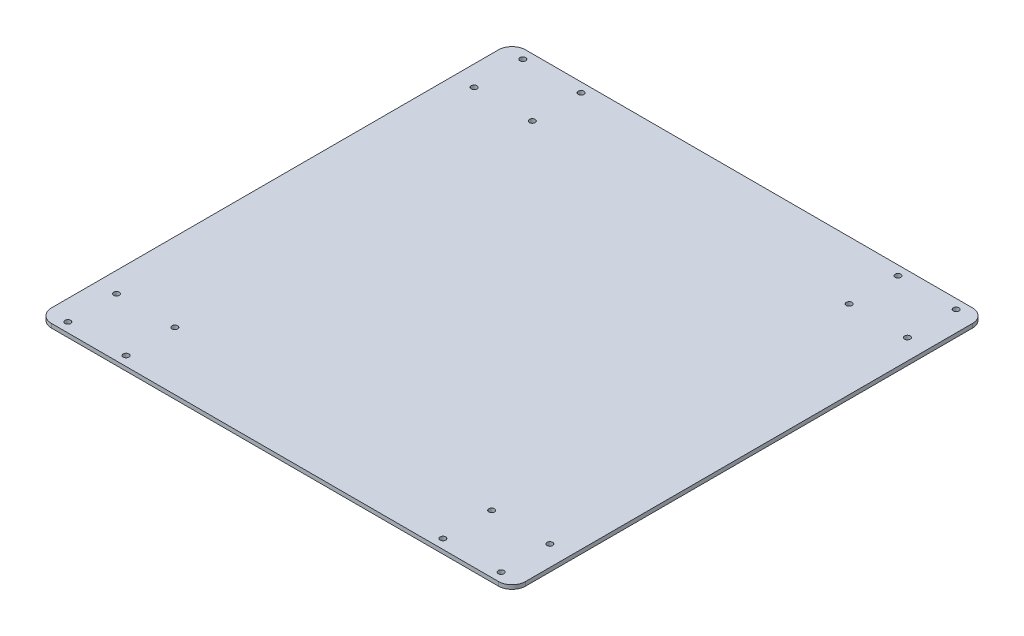
ISO-10303-21;
HEADER;
FILE_DESCRIPTION(('STEP AP214'),'2;1');
FILE_NAME('part.step','',(''),(''),'','','');
FILE_SCHEMA(('AUTOMOTIVE_DESIGN { 1 0 10303 214 1 1 1 1 }'));
ENDSEC;
DATA;
#1=APPLICATION_CONTEXT('core data for automotive mechanical design processes');
#2=APPLICATION_PROTOCOL_DEFINITION('international standard','automotive_design',2000,#1);
#3=PRODUCT_CONTEXT('',#1,'mechanical');
#4=PRODUCT('Part','Part','',(#3));
#5=PRODUCT_RELATED_PRODUCT_CATEGORY('part','',(#4));
#6=PRODUCT_DEFINITION_FORMATION('','',#4);
#7=PRODUCT_DEFINITION_CONTEXT('part definition',#1,'design');
#8=PRODUCT_DEFINITION('design','',#6,#7);
#9=PRODUCT_DEFINITION_SHAPE('','',#8);
#10=(LENGTH_UNIT() NAMED_UNIT(*) SI_UNIT(.MILLI.,.METRE.));
#11=(NAMED_UNIT(*) PLANE_ANGLE_UNIT() SI_UNIT($,.RADIAN.));
#12=(NAMED_UNIT(*) SI_UNIT($,.STERADIAN.) SOLID_ANGLE_UNIT());
#13=UNCERTAINTY_MEASURE_WITH_UNIT(LENGTH_MEASURE(1.E-05),#10,'distance_accuracy_value','');
#14=(GEOMETRIC_REPRESENTATION_CONTEXT(3) GLOBAL_UNCERTAINTY_ASSIGNED_CONTEXT((#13)) GLOBAL_UNIT_ASSIGNED_CONTEXT((#10,
#11,#12)) REPRESENTATION_CONTEXT('',''));
#15=CARTESIAN_POINT('',(0.,0.,0.));
#16=DIRECTION('',(0.,0.,1.));
#17=DIRECTION('',(1.,0.,0.));
#18=AXIS2_PLACEMENT_3D('',#15,#16,#17);
#19=CARTESIAN_POINT('',(0.,3.,0.));
#20=DIRECTION('',(1.,0.,0.));
#21=DIRECTION('',(0.,0.,-1.));
#22=AXIS2_PLACEMENT_3D('',#19,#20,#21);
#23=PLANE('',#22);
#24=DIRECTION('',(0.,0.,1.));
#25=VECTOR('',#24,1.);
#26=CARTESIAN_POINT('',(0.,3.,0.));
#27=LINE('',#26,#25);
#28=CARTESIAN_POINT('',(0.,3.,-340.));
#29=VERTEX_POINT('',#28);
#30=CARTESIAN_POINT('',(0.,3.,-10.));
#31=VERTEX_POINT('',#30);
#32=EDGE_CURVE('E127',#29,#31,#27,.T.);
#33=ORIENTED_EDGE('',*,*,#32,.F.);
#34=DIRECTION('',(0.,-1.,0.));
#35=VECTOR('',#34,1.);
#36=CARTESIAN_POINT('',(0.,3.,-340.));
#37=LINE('',#36,#35);
#38=CARTESIAN_POINT('',(0.,0.,-340.));
#39=VERTEX_POINT('',#38);
#40=EDGE_CURVE('E112',#29,#39,#37,.T.);
#41=ORIENTED_EDGE('',*,*,#40,.T.);
#42=DIRECTION('',(0.,0.,1.));
#43=VECTOR('',#42,1.);
#44=CARTESIAN_POINT('',(0.,0.,0.));
#45=LINE('',#44,#43);
#46=CARTESIAN_POINT('',(0.,0.,-10.));
#47=VERTEX_POINT('',#46);
#48=EDGE_CURVE('E124',#39,#47,#45,.T.);
#49=ORIENTED_EDGE('',*,*,#48,.T.);
#50=DIRECTION('',(0.,-1.,0.));
#51=VECTOR('',#50,1.);
#52=CARTESIAN_POINT('',(0.,3.,-10.));
#53=LINE('',#52,#51);
#54=EDGE_CURVE('E129',#47,#31,#53,.F.);
#55=ORIENTED_EDGE('',*,*,#54,.T.);
#56=EDGE_LOOP('',(#33,#41,#49,#55));
#57=FACE_BOUND('',#56,.T.);
#58=ADVANCED_FACE('F42',(#57),#23,.F.);
#59=CARTESIAN_POINT('',(0.,3.,0.));
#60=DIRECTION('',(0.,0.,-1.));
#61=DIRECTION('',(-1.,0.,0.));
#62=AXIS2_PLACEMENT_3D('',#59,#60,#61);
#63=PLANE('',#62);
#64=DIRECTION('',(1.,0.,0.));
#65=VECTOR('',#64,1.);
#66=CARTESIAN_POINT('',(0.,0.,0.));
#67=LINE('',#66,#65);
#68=CARTESIAN_POINT('',(10.,0.,0.));
#69=VERTEX_POINT('',#68);
#70=CARTESIAN_POINT('',(340.,0.,0.));
#71=VERTEX_POINT('',#70);
#72=EDGE_CURVE('E133',#69,#71,#67,.T.);
#73=ORIENTED_EDGE('',*,*,#72,.T.);
#74=DIRECTION('',(0.,-1.,0.));
#75=VECTOR('',#74,1.);
#76=CARTESIAN_POINT('',(340.,3.,0.));
#77=LINE('',#76,#75);
#78=CARTESIAN_POINT('',(340.,3.,0.));
#79=VERTEX_POINT('',#78);
#80=EDGE_CURVE('E11',#71,#79,#77,.F.);
#81=ORIENTED_EDGE('',*,*,#80,.T.);
#82=DIRECTION('',(1.,0.,0.));
#83=VECTOR('',#82,1.);
#84=CARTESIAN_POINT('',(0.,3.,0.));
#85=LINE('',#84,#83);
#86=CARTESIAN_POINT('',(10.,3.,0.));
#87=VERTEX_POINT('',#86);
#88=EDGE_CURVE('E173',#87,#79,#85,.T.);
#89=ORIENTED_EDGE('',*,*,#88,.F.);
#90=DIRECTION('',(0.,-1.,0.));
#91=VECTOR('',#90,1.);
#92=CARTESIAN_POINT('',(10.,3.,0.));
#93=LINE('',#92,#91);
#94=EDGE_CURVE('E50',#87,#69,#93,.T.);
#95=ORIENTED_EDGE('',*,*,#94,.T.);
#96=EDGE_LOOP('',(#73,#81,#89,#95));
#97=FACE_BOUND('',#96,.T.);
#98=ADVANCED_FACE('F171',(#97),#63,.F.);
#99=CARTESIAN_POINT('',(350.,3.,0.));
#100=DIRECTION('',(-1.,0.,0.));
#101=DIRECTION('',(0.,0.,1.));
#102=AXIS2_PLACEMENT_3D('',#99,#100,#101);
#103=PLANE('',#102);
#104=DIRECTION('',(0.,0.,-1.));
#105=VECTOR('',#104,1.);
#106=CARTESIAN_POINT('',(350.,0.,0.));
#107=LINE('',#106,#105);
#108=CARTESIAN_POINT('',(350.,0.,-10.));
#109=VERTEX_POINT('',#108);
#110=CARTESIAN_POINT('',(350.,0.,-340.));
#111=VERTEX_POINT('',#110);
#112=EDGE_CURVE('E137',#109,#111,#107,.T.);
#113=ORIENTED_EDGE('',*,*,#112,.T.);
#114=DIRECTION('',(0.,-1.,0.));
#115=VECTOR('',#114,1.);
#116=CARTESIAN_POINT('',(350.,3.,-340.));
#117=LINE('',#116,#115);
#118=CARTESIAN_POINT('',(350.,3.,-340.));
#119=VERTEX_POINT('',#118);
#120=EDGE_CURVE('E57',#111,#119,#117,.F.);
#121=ORIENTED_EDGE('',*,*,#120,.T.);
#122=DIRECTION('',(0.,0.,-1.));
#123=VECTOR('',#122,1.);
#124=CARTESIAN_POINT('',(350.,3.,0.));
#125=LINE('',#124,#123);
#126=CARTESIAN_POINT('',(350.,3.,-10.));
#127=VERTEX_POINT('',#126);
#128=EDGE_CURVE('E181',#127,#119,#125,.T.);
#129=ORIENTED_EDGE('',*,*,#128,.F.);
#130=DIRECTION('',(0.,-1.,0.));
#131=VECTOR('',#130,1.);
#132=CARTESIAN_POINT('',(350.,3.,-10.));
#133=LINE('',#132,#131);
#134=EDGE_CURVE('E164',#127,#109,#133,.T.);
#135=ORIENTED_EDGE('',*,*,#134,.T.);
#136=EDGE_LOOP('',(#113,#121,#129,#135));
#137=FACE_BOUND('',#136,.T.);
#138=ADVANCED_FACE('F180',(#137),#103,.F.);
#139=CARTESIAN_POINT('',(0.,3.,-350.));
#140=DIRECTION('',(0.,0.,1.));
#141=DIRECTION('',(1.,0.,0.));
#142=AXIS2_PLACEMENT_3D('',#139,#140,#141);
#143=PLANE('',#142);
#144=DIRECTION('',(-1.,0.,0.));
#145=VECTOR('',#144,1.);
#146=CARTESIAN_POINT('',(0.,0.,-350.));
#147=LINE('',#146,#145);
#148=CARTESIAN_POINT('',(340.,0.,-350.));
#149=VERTEX_POINT('',#148);
#150=CARTESIAN_POINT('',(10.,0.,-350.));
#151=VERTEX_POINT('',#150);
#152=EDGE_CURVE('E147',#149,#151,#147,.T.);
#153=ORIENTED_EDGE('',*,*,#152,.T.);
#154=DIRECTION('',(0.,-1.,0.));
#155=VECTOR('',#154,1.);
#156=CARTESIAN_POINT('',(10.,3.,-350.));
#157=LINE('',#156,#155);
#158=CARTESIAN_POINT('',(10.,3.,-350.));
#159=VERTEX_POINT('',#158);
#160=EDGE_CURVE('E113',#151,#159,#157,.F.);
#161=ORIENTED_EDGE('',*,*,#160,.T.);
#162=DIRECTION('',(-1.,0.,0.));
#163=VECTOR('',#162,1.);
#164=CARTESIAN_POINT('',(0.,3.,-350.));
#165=LINE('',#164,#163);
#166=CARTESIAN_POINT('',(340.,3.,-350.));
#167=VERTEX_POINT('',#166);
#168=EDGE_CURVE('E143',#167,#159,#165,.T.);
#169=ORIENTED_EDGE('',*,*,#168,.F.);
#170=DIRECTION('',(0.,-1.,0.));
#171=VECTOR('',#170,1.);
#172=CARTESIAN_POINT('',(340.,3.,-350.));
#173=LINE('',#172,#171);
#174=EDGE_CURVE('E118',#167,#149,#173,.T.);
#175=ORIENTED_EDGE('',*,*,#174,.T.);
#176=EDGE_LOOP('',(#153,#161,#169,#175));
#177=FACE_BOUND('',#176,.T.);
#178=ADVANCED_FACE('F285',(#177),#143,.F.);
#179=CARTESIAN_POINT('',(0.,3.,0.));
#180=DIRECTION('',(0.,-1.,0.));
#181=DIRECTION('',(0.,0.,-1.));
#182=AXIS2_PLACEMENT_3D('',#179,#180,#181);
#183=PLANE('',#182);
#184=CARTESIAN_POINT('',(292.000000000004,3.,-6.99999999999951));
#185=DIRECTION('',(0.,1.,0.));
#186=DIRECTION('',(0.,0.,1.));
#187=AXIS2_PLACEMENT_3D('',#184,#185,#186);
#188=CIRCLE('',#187,2.10000000000361);
#189=CARTESIAN_POINT('',(292.000000000004,3.,-4.8999999999959));
#190=VERTEX_POINT('',#189);
#191=EDGE_CURVE('E217',#190,#190,#188,.T.);
#192=ORIENTED_EDGE('',*,*,#191,.F.);
#193=EDGE_LOOP('',(#192));
#194=FACE_BOUND('',#193,.T.);
#195=CARTESIAN_POINT('',(335.000000000004,3.,-6.99999999999884));
#196=DIRECTION('',(0.,1.,0.));
#197=DIRECTION('',(0.,0.,1.));
#198=AXIS2_PLACEMENT_3D('',#195,#196,#197);
#199=CIRCLE('',#198,2.1000000000031);
#200=CARTESIAN_POINT('',(335.000000000004,3.,-4.89999999999574));
#201=VERTEX_POINT('',#200);
#202=EDGE_CURVE('E224',#201,#201,#199,.T.);
#203=ORIENTED_EDGE('',*,*,#202,.F.);
#204=EDGE_LOOP('',(#203));
#205=FACE_BOUND('',#204,.T.);
#206=CARTESIAN_POINT('',(335.000000000004,3.,-343.000000000001));
#207=DIRECTION('',(0.,1.,0.));
#208=DIRECTION('',(0.,0.,-1.));
#209=AXIS2_PLACEMENT_3D('',#206,#207,#208);
#210=CIRCLE('',#209,2.1000000000031);
#211=CARTESIAN_POINT('',(335.000000000004,3.,-345.100000000004));
#212=VERTEX_POINT('',#211);
#213=EDGE_CURVE('E230',#212,#212,#210,.T.);
#214=ORIENTED_EDGE('',*,*,#213,.F.);
#215=EDGE_LOOP('',(#214));
#216=FACE_BOUND('',#215,.T.);
#217=CARTESIAN_POINT('',(292.000000000004,3.,-343.));
#218=DIRECTION('',(0.,1.,0.));
#219=DIRECTION('',(0.,0.,-1.));
#220=AXIS2_PLACEMENT_3D('',#217,#218,#219);
#221=CIRCLE('',#220,2.10000000000361);
#222=CARTESIAN_POINT('',(292.000000000004,3.,-345.100000000004));
#223=VERTEX_POINT('',#222);
#224=EDGE_CURVE('E194',#223,#223,#221,.T.);
#225=ORIENTED_EDGE('',*,*,#224,.F.);
#226=EDGE_LOOP('',(#225));
#227=FACE_BOUND('',#226,.T.);
#228=CARTESIAN_POINT('',(335.000000000004,3.,-307.000000000001));
#229=DIRECTION('',(0.,1.,0.));
#230=DIRECTION('',(0.,0.,-1.));
#231=AXIS2_PLACEMENT_3D('',#228,#229,#230);
#232=CIRCLE('',#231,2.10000000000308);
#233=CARTESIAN_POINT('',(335.000000000004,3.,-309.100000000004));
#234=VERTEX_POINT('',#233);
#235=EDGE_CURVE('E193',#234,#234,#232,.T.);
#236=ORIENTED_EDGE('',*,*,#235,.F.);
#237=EDGE_LOOP('',(#236));
#238=FACE_BOUND('',#237,.T.);
#239=CARTESIAN_POINT('',(292.000000000002,3.,-307.000000000001));
#240=DIRECTION('',(0.,1.,0.));
#241=DIRECTION('',(0.,0.,-1.));
#242=AXIS2_PLACEMENT_3D('',#239,#240,#241);
#243=CIRCLE('',#242,2.10000000000225);
#244=CARTESIAN_POINT('',(292.000000000002,3.,-309.100000000003));
#245=VERTEX_POINT('',#244);
#246=EDGE_CURVE('E200',#245,#245,#243,.T.);
#247=ORIENTED_EDGE('',*,*,#246,.F.);
#248=EDGE_LOOP('',(#247));
#249=FACE_BOUND('',#248,.T.);
#250=CARTESIAN_POINT('',(14.9999999999964,3.,-307.000000000001));
#251=DIRECTION('',(0.,1.,0.));
#252=DIRECTION('',(0.,0.,1.));
#253=AXIS2_PLACEMENT_3D('',#250,#251,#252);
#254=CIRCLE('',#253,2.10000000000309);
#255=CARTESIAN_POINT('',(14.9999999999964,3.,-304.899999999998));
#256=VERTEX_POINT('',#255);
#257=EDGE_CURVE('E206',#256,#256,#254,.T.);
#258=ORIENTED_EDGE('',*,*,#257,.F.);
#259=EDGE_LOOP('',(#258));
#260=FACE_BOUND('',#259,.T.);
#261=CARTESIAN_POINT('',(57.999999999996,3.,-343.));
#262=DIRECTION('',(0.,1.,0.));
#263=DIRECTION('',(0.,0.,1.));
#264=AXIS2_PLACEMENT_3D('',#261,#262,#263);
#265=CIRCLE('',#264,2.10000000000364);
#266=CARTESIAN_POINT('',(57.999999999996,3.,-340.899999999997));
#267=VERTEX_POINT('',#266);
#268=EDGE_CURVE('E188',#267,#267,#265,.T.);
#269=ORIENTED_EDGE('',*,*,#268,.F.);
#270=EDGE_LOOP('',(#269));
#271=FACE_BOUND('',#270,.T.);
#272=CARTESIAN_POINT('',(57.9999999999977,3.,-307.000000000001));
#273=DIRECTION('',(0.,1.,0.));
#274=DIRECTION('',(0.,0.,1.));
#275=AXIS2_PLACEMENT_3D('',#272,#273,#274);
#276=CIRCLE('',#275,2.10000000000224);
#277=CARTESIAN_POINT('',(57.9999999999977,3.,-304.899999999999));
#278=VERTEX_POINT('',#277);
#279=EDGE_CURVE('E265',#278,#278,#276,.T.);
#280=ORIENTED_EDGE('',*,*,#279,.F.);
#281=EDGE_LOOP('',(#280));
#282=FACE_BOUND('',#281,.T.);
#283=CARTESIAN_POINT('',(14.9999999999964,3.,-6.99999999999884));
#284=DIRECTION('',(0.,1.,0.));
#285=DIRECTION('',(0.,0.,-1.));
#286=AXIS2_PLACEMENT_3D('',#283,#284,#285);
#287=CIRCLE('',#286,2.10000000000309);
#288=CARTESIAN_POINT('',(14.9999999999964,3.,-9.10000000000193));
#289=VERTEX_POINT('',#288);
#290=EDGE_CURVE('E271',#289,#289,#287,.T.);
#291=ORIENTED_EDGE('',*,*,#290,.F.);
#292=EDGE_LOOP('',(#291));
#293=FACE_BOUND('',#292,.T.);
#294=CARTESIAN_POINT('',(57.999999999996,3.,-6.99999999999951));
#295=DIRECTION('',(0.,1.,0.));
#296=DIRECTION('',(0.,0.,-1.));
#297=AXIS2_PLACEMENT_3D('',#294,#295,#296);
#298=CIRCLE('',#297,2.10000000000364);
#299=CARTESIAN_POINT('',(57.999999999996,3.,-9.10000000000315));
#300=VERTEX_POINT('',#299);
#301=EDGE_CURVE('E242',#300,#300,#298,.T.);
#302=ORIENTED_EDGE('',*,*,#301,.F.);
#303=EDGE_LOOP('',(#302));
#304=FACE_BOUND('',#303,.T.);
#305=CARTESIAN_POINT('',(14.9999999999964,3.,-42.9999999999988));
#306=DIRECTION('',(0.,1.,0.));
#307=DIRECTION('',(0.,0.,-1.));
#308=AXIS2_PLACEMENT_3D('',#305,#306,#307);
#309=CIRCLE('',#308,2.10000000000309);
#310=CARTESIAN_POINT('',(14.9999999999964,3.,-45.1000000000019));
#311=VERTEX_POINT('',#310);
#312=EDGE_CURVE('E241',#311,#311,#309,.T.);
#313=ORIENTED_EDGE('',*,*,#312,.F.);
#314=EDGE_LOOP('',(#313));
#315=FACE_BOUND('',#314,.T.);
#316=CARTESIAN_POINT('',(57.9999999999977,3.,-42.9999999999988));
#317=DIRECTION('',(0.,1.,0.));
#318=DIRECTION('',(0.,0.,-1.));
#319=AXIS2_PLACEMENT_3D('',#316,#317,#318);
#320=CIRCLE('',#319,2.10000000000224);
#321=CARTESIAN_POINT('',(57.9999999999977,3.,-45.100000000001));
#322=VERTEX_POINT('',#321);
#323=EDGE_CURVE('E248',#322,#322,#320,.T.);
#324=ORIENTED_EDGE('',*,*,#323,.F.);
#325=EDGE_LOOP('',(#324));
#326=FACE_BOUND('',#325,.T.);
#327=CARTESIAN_POINT('',(292.000000000002,3.,-42.9999999999988));
#328=DIRECTION('',(0.,1.,0.));
#329=DIRECTION('',(0.,0.,1.));
#330=AXIS2_PLACEMENT_3D('',#327,#328,#329);
#331=CIRCLE('',#330,2.10000000000225);
#332=CARTESIAN_POINT('',(292.000000000002,3.,-40.8999999999966));
#333=VERTEX_POINT('',#332);
#334=EDGE_CURVE('E254',#333,#333,#331,.T.);
#335=ORIENTED_EDGE('',*,*,#334,.F.);
#336=EDGE_LOOP('',(#335));
#337=FACE_BOUND('',#336,.T.);
#338=CARTESIAN_POINT('',(335.000000000004,3.,-42.9999999999989));
#339=DIRECTION('',(0.,1.,0.));
#340=DIRECTION('',(0.,0.,1.));
#341=AXIS2_PLACEMENT_3D('',#338,#339,#340);
#342=CIRCLE('',#341,2.10000000000316);
#343=CARTESIAN_POINT('',(335.000000000004,3.,-40.8999999999957));
#344=VERTEX_POINT('',#343);
#345=EDGE_CURVE('E218',#344,#344,#342,.T.);
#346=ORIENTED_EDGE('',*,*,#345,.F.);
#347=EDGE_LOOP('',(#346));
#348=FACE_BOUND('',#347,.T.);
#349=CARTESIAN_POINT('',(14.9999999999964,3.,-343.000000000001));
#350=DIRECTION('',(0.,1.,0.));
#351=DIRECTION('',(0.,0.,1.));
#352=AXIS2_PLACEMENT_3D('',#349,#350,#351);
#353=CIRCLE('',#352,2.10000000000309);
#354=CARTESIAN_POINT('',(14.9999999999964,3.,-340.899999999998));
#355=VERTEX_POINT('',#354);
#356=EDGE_CURVE('E140',#355,#355,#353,.T.);
#357=ORIENTED_EDGE('',*,*,#356,.F.);
#358=EDGE_LOOP('',(#357));
#359=FACE_BOUND('',#358,.T.);
#360=ORIENTED_EDGE('',*,*,#168,.T.);
#361=CARTESIAN_POINT('',(10.,3.,-340.));
#362=DIRECTION('',(0.,-1.,0.));
#363=DIRECTION('',(0.,0.,-1.));
#364=AXIS2_PLACEMENT_3D('',#361,#362,#363);
#365=CIRCLE('',#364,10.);
#366=EDGE_CURVE('E162',#159,#29,#365,.F.);
#367=ORIENTED_EDGE('',*,*,#366,.T.);
#368=ORIENTED_EDGE('',*,*,#32,.T.);
#369=CARTESIAN_POINT('',(10.,3.,-10.));
#370=DIRECTION('',(0.,-1.,0.));
#371=DIRECTION('',(0.,0.,-1.));
#372=AXIS2_PLACEMENT_3D('',#369,#370,#371);
#373=CIRCLE('',#372,10.);
#374=EDGE_CURVE('E157',#31,#87,#373,.F.);
#375=ORIENTED_EDGE('',*,*,#374,.T.);
#376=ORIENTED_EDGE('',*,*,#88,.T.);
#377=CARTESIAN_POINT('',(340.,3.,-10.));
#378=DIRECTION('',(0.,-1.,0.));
#379=DIRECTION('',(0.,0.,-1.));
#380=AXIS2_PLACEMENT_3D('',#377,#378,#379);
#381=CIRCLE('',#380,10.);
#382=EDGE_CURVE('E64',#79,#127,#381,.F.);
#383=ORIENTED_EDGE('',*,*,#382,.T.);
#384=ORIENTED_EDGE('',*,*,#128,.T.);
#385=CARTESIAN_POINT('',(340.,3.,-340.));
#386=DIRECTION('',(0.,-1.,0.));
#387=DIRECTION('',(0.,0.,-1.));
#388=AXIS2_PLACEMENT_3D('',#385,#386,#387);
#389=CIRCLE('',#388,10.);
#390=EDGE_CURVE('E160',#119,#167,#389,.F.);
#391=ORIENTED_EDGE('',*,*,#390,.T.);
#392=EDGE_LOOP('',(#360,#367,#368,#375,#376,#383,#384,#391));
#393=FACE_BOUND('',#392,.T.);
#394=ADVANCED_FACE('F282',(#194,#205,#216,#227,#238,#249,#260,#271,#282,#293,#304,#315,#326,
#337,#348,#359,#393),#183,.F.);
#395=CARTESIAN_POINT('',(0.,0.,0.));
#396=DIRECTION('',(0.,-1.,0.));
#397=DIRECTION('',(0.,0.,-1.));
#398=AXIS2_PLACEMENT_3D('',#395,#396,#397);
#399=PLANE('',#398);
#400=CARTESIAN_POINT('',(292.000000000004,0.,-6.99999999999951));
#401=DIRECTION('',(0.,1.,0.));
#402=DIRECTION('',(0.,0.,1.));
#403=AXIS2_PLACEMENT_3D('',#400,#401,#402);
#404=CIRCLE('',#403,2.10000000000361);
#405=CARTESIAN_POINT('',(292.000000000004,0.,-4.8999999999959));
#406=VERTEX_POINT('',#405);
#407=EDGE_CURVE('E214',#406,#406,#404,.T.);
#408=ORIENTED_EDGE('',*,*,#407,.T.);
#409=EDGE_LOOP('',(#408));
#410=FACE_BOUND('',#409,.T.);
#411=CARTESIAN_POINT('',(335.000000000004,0.,-6.99999999999884));
#412=DIRECTION('',(0.,1.,0.));
#413=DIRECTION('',(0.,0.,1.));
#414=AXIS2_PLACEMENT_3D('',#411,#412,#413);
#415=CIRCLE('',#414,2.1000000000031);
#416=CARTESIAN_POINT('',(335.000000000004,0.,-4.89999999999574));
#417=VERTEX_POINT('',#416);
#418=EDGE_CURVE('E221',#417,#417,#415,.T.);
#419=ORIENTED_EDGE('',*,*,#418,.T.);
#420=EDGE_LOOP('',(#419));
#421=FACE_BOUND('',#420,.T.);
#422=CARTESIAN_POINT('',(335.000000000004,0.,-343.000000000001));
#423=DIRECTION('',(0.,1.,0.));
#424=DIRECTION('',(0.,0.,-1.));
#425=AXIS2_PLACEMENT_3D('',#422,#423,#424);
#426=CIRCLE('',#425,2.1000000000031);
#427=CARTESIAN_POINT('',(335.000000000004,0.,-345.100000000004));
#428=VERTEX_POINT('',#427);
#429=EDGE_CURVE('E227',#428,#428,#426,.T.);
#430=ORIENTED_EDGE('',*,*,#429,.T.);
#431=EDGE_LOOP('',(#430));
#432=FACE_BOUND('',#431,.T.);
#433=CARTESIAN_POINT('',(292.000000000004,0.,-343.));
#434=DIRECTION('',(0.,1.,0.));
#435=DIRECTION('',(0.,0.,-1.));
#436=AXIS2_PLACEMENT_3D('',#433,#434,#435);
#437=CIRCLE('',#436,2.10000000000361);
#438=CARTESIAN_POINT('',(292.000000000004,0.,-345.100000000004));
#439=VERTEX_POINT('',#438);
#440=EDGE_CURVE('E233',#439,#439,#437,.T.);
#441=ORIENTED_EDGE('',*,*,#440,.T.);
#442=EDGE_LOOP('',(#441));
#443=FACE_BOUND('',#442,.T.);
#444=CARTESIAN_POINT('',(335.000000000004,0.,-307.000000000001));
#445=DIRECTION('',(0.,1.,0.));
#446=DIRECTION('',(0.,0.,-1.));
#447=AXIS2_PLACEMENT_3D('',#444,#445,#446);
#448=CIRCLE('',#447,2.10000000000308);
#449=CARTESIAN_POINT('',(335.000000000004,0.,-309.100000000004));
#450=VERTEX_POINT('',#449);
#451=EDGE_CURVE('E190',#450,#450,#448,.T.);
#452=ORIENTED_EDGE('',*,*,#451,.T.);
#453=EDGE_LOOP('',(#452));
#454=FACE_BOUND('',#453,.T.);
#455=CARTESIAN_POINT('',(292.000000000002,0.,-307.000000000001));
#456=DIRECTION('',(0.,1.,0.));
#457=DIRECTION('',(0.,0.,-1.));
#458=AXIS2_PLACEMENT_3D('',#455,#456,#457);
#459=CIRCLE('',#458,2.10000000000225);
#460=CARTESIAN_POINT('',(292.000000000002,0.,-309.100000000003));
#461=VERTEX_POINT('',#460);
#462=EDGE_CURVE('E197',#461,#461,#459,.T.);
#463=ORIENTED_EDGE('',*,*,#462,.T.);
#464=EDGE_LOOP('',(#463));
#465=FACE_BOUND('',#464,.T.);
#466=CARTESIAN_POINT('',(14.9999999999964,0.,-307.000000000001));
#467=DIRECTION('',(0.,1.,0.));
#468=DIRECTION('',(0.,0.,1.));
#469=AXIS2_PLACEMENT_3D('',#466,#467,#468);
#470=CIRCLE('',#469,2.10000000000309);
#471=CARTESIAN_POINT('',(14.9999999999964,0.,-304.899999999998));
#472=VERTEX_POINT('',#471);
#473=EDGE_CURVE('E203',#472,#472,#470,.T.);
#474=ORIENTED_EDGE('',*,*,#473,.T.);
#475=EDGE_LOOP('',(#474));
#476=FACE_BOUND('',#475,.T.);
#477=CARTESIAN_POINT('',(57.999999999996,0.,-343.));
#478=DIRECTION('',(0.,1.,0.));
#479=DIRECTION('',(0.,0.,1.));
#480=AXIS2_PLACEMENT_3D('',#477,#478,#479);
#481=CIRCLE('',#480,2.10000000000364);
#482=CARTESIAN_POINT('',(57.999999999996,0.,-340.899999999997));
#483=VERTEX_POINT('',#482);
#484=EDGE_CURVE('E209',#483,#483,#481,.T.);
#485=ORIENTED_EDGE('',*,*,#484,.T.);
#486=EDGE_LOOP('',(#485));
#487=FACE_BOUND('',#486,.T.);
#488=CARTESIAN_POINT('',(57.9999999999977,0.,-307.000000000001));
#489=DIRECTION('',(0.,1.,0.));
#490=DIRECTION('',(0.,0.,1.));
#491=AXIS2_PLACEMENT_3D('',#488,#489,#490);
#492=CIRCLE('',#491,2.10000000000224);
#493=CARTESIAN_POINT('',(57.9999999999977,0.,-304.899999999999));
#494=VERTEX_POINT('',#493);
#495=EDGE_CURVE('E262',#494,#494,#492,.T.);
#496=ORIENTED_EDGE('',*,*,#495,.T.);
#497=EDGE_LOOP('',(#496));
#498=FACE_BOUND('',#497,.T.);
#499=CARTESIAN_POINT('',(14.9999999999964,0.,-6.99999999999884));
#500=DIRECTION('',(0.,1.,0.));
#501=DIRECTION('',(0.,0.,-1.));
#502=AXIS2_PLACEMENT_3D('',#499,#500,#501);
#503=CIRCLE('',#502,2.10000000000309);
#504=CARTESIAN_POINT('',(14.9999999999964,0.,-9.10000000000193));
#505=VERTEX_POINT('',#504);
#506=EDGE_CURVE('E268',#505,#505,#503,.T.);
#507=ORIENTED_EDGE('',*,*,#506,.T.);
#508=EDGE_LOOP('',(#507));
#509=FACE_BOUND('',#508,.T.);
#510=CARTESIAN_POINT('',(57.999999999996,0.,-6.99999999999951));
#511=DIRECTION('',(0.,1.,0.));
#512=DIRECTION('',(0.,0.,-1.));
#513=AXIS2_PLACEMENT_3D('',#510,#511,#512);
#514=CIRCLE('',#513,2.10000000000364);
#515=CARTESIAN_POINT('',(57.999999999996,0.,-9.10000000000315));
#516=VERTEX_POINT('',#515);
#517=EDGE_CURVE('E274',#516,#516,#514,.T.);
#518=ORIENTED_EDGE('',*,*,#517,.T.);
#519=EDGE_LOOP('',(#518));
#520=FACE_BOUND('',#519,.T.);
#521=CARTESIAN_POINT('',(14.9999999999964,0.,-42.9999999999988));
#522=DIRECTION('',(0.,1.,0.));
#523=DIRECTION('',(0.,0.,-1.));
#524=AXIS2_PLACEMENT_3D('',#521,#522,#523);
#525=CIRCLE('',#524,2.10000000000309);
#526=CARTESIAN_POINT('',(14.9999999999964,0.,-45.1000000000019));
#527=VERTEX_POINT('',#526);
#528=EDGE_CURVE('E238',#527,#527,#525,.T.);
#529=ORIENTED_EDGE('',*,*,#528,.T.);
#530=EDGE_LOOP('',(#529));
#531=FACE_BOUND('',#530,.T.);
#532=CARTESIAN_POINT('',(57.9999999999977,0.,-42.9999999999988));
#533=DIRECTION('',(0.,1.,0.));
#534=DIRECTION('',(0.,0.,-1.));
#535=AXIS2_PLACEMENT_3D('',#532,#533,#534);
#536=CIRCLE('',#535,2.10000000000224);
#537=CARTESIAN_POINT('',(57.9999999999977,0.,-45.100000000001));
#538=VERTEX_POINT('',#537);
#539=EDGE_CURVE('E245',#538,#538,#536,.T.);
#540=ORIENTED_EDGE('',*,*,#539,.T.);
#541=EDGE_LOOP('',(#540));
#542=FACE_BOUND('',#541,.T.);
#543=CARTESIAN_POINT('',(292.000000000002,0.,-42.9999999999988));
#544=DIRECTION('',(0.,1.,0.));
#545=DIRECTION('',(0.,0.,1.));
#546=AXIS2_PLACEMENT_3D('',#543,#544,#545);
#547=CIRCLE('',#546,2.10000000000225);
#548=CARTESIAN_POINT('',(292.000000000002,0.,-40.8999999999966));
#549=VERTEX_POINT('',#548);
#550=EDGE_CURVE('E251',#549,#549,#547,.T.);
#551=ORIENTED_EDGE('',*,*,#550,.T.);
#552=EDGE_LOOP('',(#551));
#553=FACE_BOUND('',#552,.T.);
#554=CARTESIAN_POINT('',(335.000000000004,0.,-42.9999999999989));
#555=DIRECTION('',(0.,1.,0.));
#556=DIRECTION('',(0.,0.,1.));
#557=AXIS2_PLACEMENT_3D('',#554,#555,#556);
#558=CIRCLE('',#557,2.10000000000316);
#559=CARTESIAN_POINT('',(335.000000000004,0.,-40.8999999999957));
#560=VERTEX_POINT('',#559);
#561=EDGE_CURVE('E257',#560,#560,#558,.T.);
#562=ORIENTED_EDGE('',*,*,#561,.T.);
#563=EDGE_LOOP('',(#562));
#564=FACE_BOUND('',#563,.T.);
#565=CARTESIAN_POINT('',(14.9999999999964,0.,-343.000000000001));
#566=DIRECTION('',(0.,1.,0.));
#567=DIRECTION('',(0.,0.,1.));
#568=AXIS2_PLACEMENT_3D('',#565,#566,#567);
#569=CIRCLE('',#568,2.10000000000309);
#570=CARTESIAN_POINT('',(14.9999999999964,0.,-340.899999999998));
#571=VERTEX_POINT('',#570);
#572=EDGE_CURVE('E134',#571,#571,#569,.T.);
#573=ORIENTED_EDGE('',*,*,#572,.T.);
#574=EDGE_LOOP('',(#573));
#575=FACE_BOUND('',#574,.T.);
#576=ORIENTED_EDGE('',*,*,#48,.F.);
#577=CARTESIAN_POINT('',(10.,0.,-340.));
#578=DIRECTION('',(0.,-1.,0.));
#579=DIRECTION('',(0.,0.,-1.));
#580=AXIS2_PLACEMENT_3D('',#577,#578,#579);
#581=CIRCLE('',#580,10.);
#582=EDGE_CURVE('E108',#39,#151,#581,.T.);
#583=ORIENTED_EDGE('',*,*,#582,.T.);
#584=ORIENTED_EDGE('',*,*,#152,.F.);
#585=CARTESIAN_POINT('',(340.,0.,-340.));
#586=DIRECTION('',(0.,-1.,0.));
#587=DIRECTION('',(0.,0.,-1.));
#588=AXIS2_PLACEMENT_3D('',#585,#586,#587);
#589=CIRCLE('',#588,10.);
#590=EDGE_CURVE('E119',#149,#111,#589,.T.);
#591=ORIENTED_EDGE('',*,*,#590,.T.);
#592=ORIENTED_EDGE('',*,*,#112,.F.);
#593=CARTESIAN_POINT('',(340.,0.,-10.));
#594=DIRECTION('',(0.,-1.,0.));
#595=DIRECTION('',(0.,0.,-1.));
#596=AXIS2_PLACEMENT_3D('',#593,#594,#595);
#597=CIRCLE('',#596,10.);
#598=EDGE_CURVE('E151',#109,#71,#597,.T.);
#599=ORIENTED_EDGE('',*,*,#598,.T.);
#600=ORIENTED_EDGE('',*,*,#72,.F.);
#601=CARTESIAN_POINT('',(10.,0.,-10.));
#602=DIRECTION('',(0.,-1.,0.));
#603=DIRECTION('',(0.,0.,-1.));
#604=AXIS2_PLACEMENT_3D('',#601,#602,#603);
#605=CIRCLE('',#604,10.);
#606=EDGE_CURVE('E128',#69,#47,#605,.T.);
#607=ORIENTED_EDGE('',*,*,#606,.T.);
#608=EDGE_LOOP('',(#576,#583,#584,#591,#592,#599,#600,#607));
#609=FACE_BOUND('',#608,.T.);
#610=ADVANCED_FACE('F131',(#410,#421,#432,#443,#454,#465,#476,#487,#498,#509,#520,#531,#542,
#553,#564,#575,#609),#399,.T.);
#611=CARTESIAN_POINT('',(10.,3.,-340.));
#612=DIRECTION('',(0.,-1.,0.));
#613=DIRECTION('',(0.,0.,-1.));
#614=AXIS2_PLACEMENT_3D('',#611,#612,#613);
#615=CYLINDRICAL_SURFACE('',#614,10.);
#616=ORIENTED_EDGE('',*,*,#366,.F.);
#617=ORIENTED_EDGE('',*,*,#160,.F.);
#618=ORIENTED_EDGE('',*,*,#582,.F.);
#619=ORIENTED_EDGE('',*,*,#40,.F.);
#620=EDGE_LOOP('',(#616,#617,#618,#619));
#621=FACE_BOUND('',#620,.T.);
#622=ADVANCED_FACE('F111',(#621),#615,.T.);
#623=CARTESIAN_POINT('',(340.,3.,-340.));
#624=DIRECTION('',(0.,-1.,0.));
#625=DIRECTION('',(0.,0.,-1.));
#626=AXIS2_PLACEMENT_3D('',#623,#624,#625);
#627=CYLINDRICAL_SURFACE('',#626,10.);
#628=ORIENTED_EDGE('',*,*,#390,.F.);
#629=ORIENTED_EDGE('',*,*,#120,.F.);
#630=ORIENTED_EDGE('',*,*,#590,.F.);
#631=ORIENTED_EDGE('',*,*,#174,.F.);
#632=EDGE_LOOP('',(#628,#629,#630,#631));
#633=FACE_BOUND('',#632,.T.);
#634=ADVANCED_FACE('F301',(#633),#627,.T.);
#635=CARTESIAN_POINT('',(340.,3.,-10.));
#636=DIRECTION('',(0.,-1.,0.));
#637=DIRECTION('',(0.,0.,-1.));
#638=AXIS2_PLACEMENT_3D('',#635,#636,#637);
#639=CYLINDRICAL_SURFACE('',#638,10.);
#640=ORIENTED_EDGE('',*,*,#382,.F.);
#641=ORIENTED_EDGE('',*,*,#80,.F.);
#642=ORIENTED_EDGE('',*,*,#598,.F.);
#643=ORIENTED_EDGE('',*,*,#134,.F.);
#644=EDGE_LOOP('',(#640,#641,#642,#643));
#645=FACE_BOUND('',#644,.T.);
#646=ADVANCED_FACE('F179',(#645),#639,.T.);
#647=CARTESIAN_POINT('',(10.,3.,-10.));
#648=DIRECTION('',(0.,-1.,0.));
#649=DIRECTION('',(0.,0.,-1.));
#650=AXIS2_PLACEMENT_3D('',#647,#648,#649);
#651=CYLINDRICAL_SURFACE('',#650,10.);
#652=ORIENTED_EDGE('',*,*,#374,.F.);
#653=ORIENTED_EDGE('',*,*,#54,.F.);
#654=ORIENTED_EDGE('',*,*,#606,.F.);
#655=ORIENTED_EDGE('',*,*,#94,.F.);
#656=EDGE_LOOP('',(#652,#653,#654,#655));
#657=FACE_BOUND('',#656,.T.);
#658=ADVANCED_FACE('F44',(#657),#651,.T.);
#659=CARTESIAN_POINT('',(14.9999999999964,0.,-343.000000000001));
#660=DIRECTION('',(0.,1.,0.));
#661=DIRECTION('',(0.,0.,1.));
#662=AXIS2_PLACEMENT_3D('',#659,#660,#661);
#663=CYLINDRICAL_SURFACE('',#662,2.10000000000309);
#664=ORIENTED_EDGE('',*,*,#572,.F.);
#665=EDGE_LOOP('',(#664));
#666=FACE_BOUND('',#665,.T.);
#667=ORIENTED_EDGE('',*,*,#356,.T.);
#668=EDGE_LOOP('',(#667));
#669=FACE_BOUND('',#668,.T.);
#670=ADVANCED_FACE('F323',(#666,#669),#663,.F.);
#671=CARTESIAN_POINT('',(335.000000000004,0.,-42.9999999999989));
#672=DIRECTION('',(0.,1.,0.));
#673=DIRECTION('',(0.,0.,1.));
#674=AXIS2_PLACEMENT_3D('',#671,#672,#673);
#675=CYLINDRICAL_SURFACE('',#674,2.10000000000316);
#676=ORIENTED_EDGE('',*,*,#561,.F.);
#677=EDGE_LOOP('',(#676));
#678=FACE_BOUND('',#677,.T.);
#679=ORIENTED_EDGE('',*,*,#345,.T.);
#680=EDGE_LOOP('',(#679));
#681=FACE_BOUND('',#680,.T.);
#682=ADVANCED_FACE('F326',(#678,#681),#675,.F.);
#683=CARTESIAN_POINT('',(292.000000000002,0.,-42.9999999999988));
#684=DIRECTION('',(0.,1.,0.));
#685=DIRECTION('',(0.,0.,1.));
#686=AXIS2_PLACEMENT_3D('',#683,#684,#685);
#687=CYLINDRICAL_SURFACE('',#686,2.10000000000225);
#688=ORIENTED_EDGE('',*,*,#550,.F.);
#689=EDGE_LOOP('',(#688));
#690=FACE_BOUND('',#689,.T.);
#691=ORIENTED_EDGE('',*,*,#334,.T.);
#692=EDGE_LOOP('',(#691));
#693=FACE_BOUND('',#692,.T.);
#694=ADVANCED_FACE('F368',(#690,#693),#687,.F.);
#695=CARTESIAN_POINT('',(57.9999999999977,0.,-42.9999999999988));
#696=DIRECTION('',(0.,1.,0.));
#697=DIRECTION('',(0.,0.,1.));
#698=AXIS2_PLACEMENT_3D('',#695,#696,#697);
#699=CYLINDRICAL_SURFACE('',#698,2.10000000000224);
#700=ORIENTED_EDGE('',*,*,#539,.F.);
#701=EDGE_LOOP('',(#700));
#702=FACE_BOUND('',#701,.T.);
#703=ORIENTED_EDGE('',*,*,#323,.T.);
#704=EDGE_LOOP('',(#703));
#705=FACE_BOUND('',#704,.T.);
#706=ADVANCED_FACE('F364',(#702,#705),#699,.F.);
#707=CARTESIAN_POINT('',(14.9999999999964,0.,-42.9999999999988));
#708=DIRECTION('',(0.,1.,0.));
#709=DIRECTION('',(0.,0.,1.));
#710=AXIS2_PLACEMENT_3D('',#707,#708,#709);
#711=CYLINDRICAL_SURFACE('',#710,2.10000000000309);
#712=ORIENTED_EDGE('',*,*,#528,.F.);
#713=EDGE_LOOP('',(#712));
#714=FACE_BOUND('',#713,.T.);
#715=ORIENTED_EDGE('',*,*,#312,.T.);
#716=EDGE_LOOP('',(#715));
#717=FACE_BOUND('',#716,.T.);
#718=ADVANCED_FACE('F361',(#714,#717),#711,.F.);
#719=CARTESIAN_POINT('',(57.999999999996,0.,-6.99999999999951));
#720=DIRECTION('',(0.,1.,0.));
#721=DIRECTION('',(0.,0.,1.));
#722=AXIS2_PLACEMENT_3D('',#719,#720,#721);
#723=CYLINDRICAL_SURFACE('',#722,2.10000000000364);
#724=ORIENTED_EDGE('',*,*,#517,.F.);
#725=EDGE_LOOP('',(#724));
#726=FACE_BOUND('',#725,.T.);
#727=ORIENTED_EDGE('',*,*,#301,.T.);
#728=EDGE_LOOP('',(#727));
#729=FACE_BOUND('',#728,.T.);
#730=ADVANCED_FACE('F280',(#726,#729),#723,.F.);
#731=CARTESIAN_POINT('',(14.9999999999964,0.,-6.99999999999884));
#732=DIRECTION('',(0.,1.,0.));
#733=DIRECTION('',(0.,0.,1.));
#734=AXIS2_PLACEMENT_3D('',#731,#732,#733);
#735=CYLINDRICAL_SURFACE('',#734,2.10000000000309);
#736=ORIENTED_EDGE('',*,*,#506,.F.);
#737=EDGE_LOOP('',(#736));
#738=FACE_BOUND('',#737,.T.);
#739=ORIENTED_EDGE('',*,*,#290,.T.);
#740=EDGE_LOOP('',(#739));
#741=FACE_BOUND('',#740,.T.);
#742=ADVANCED_FACE('F378',(#738,#741),#735,.F.);
#743=CARTESIAN_POINT('',(57.9999999999977,0.,-307.000000000001));
#744=DIRECTION('',(0.,1.,0.));
#745=DIRECTION('',(0.,0.,1.));
#746=AXIS2_PLACEMENT_3D('',#743,#744,#745);
#747=CYLINDRICAL_SURFACE('',#746,2.10000000000224);
#748=ORIENTED_EDGE('',*,*,#495,.F.);
#749=EDGE_LOOP('',(#748));
#750=FACE_BOUND('',#749,.T.);
#751=ORIENTED_EDGE('',*,*,#279,.T.);
#752=EDGE_LOOP('',(#751));
#753=FACE_BOUND('',#752,.T.);
#754=ADVANCED_FACE('F344',(#750,#753),#747,.F.);
#755=CARTESIAN_POINT('',(57.999999999996,0.,-343.));
#756=DIRECTION('',(0.,1.,0.));
#757=DIRECTION('',(0.,0.,1.));
#758=AXIS2_PLACEMENT_3D('',#755,#756,#757);
#759=CYLINDRICAL_SURFACE('',#758,2.10000000000364);
#760=ORIENTED_EDGE('',*,*,#484,.F.);
#761=EDGE_LOOP('',(#760));
#762=FACE_BOUND('',#761,.T.);
#763=ORIENTED_EDGE('',*,*,#268,.T.);
#764=EDGE_LOOP('',(#763));
#765=FACE_BOUND('',#764,.T.);
#766=ADVANCED_FACE('F340',(#762,#765),#759,.F.);
#767=CARTESIAN_POINT('',(14.9999999999964,0.,-307.000000000001));
#768=DIRECTION('',(0.,1.,0.));
#769=DIRECTION('',(0.,0.,1.));
#770=AXIS2_PLACEMENT_3D('',#767,#768,#769);
#771=CYLINDRICAL_SURFACE('',#770,2.10000000000309);
#772=ORIENTED_EDGE('',*,*,#473,.F.);
#773=EDGE_LOOP('',(#772));
#774=FACE_BOUND('',#773,.T.);
#775=ORIENTED_EDGE('',*,*,#257,.T.);
#776=EDGE_LOOP('',(#775));
#777=FACE_BOUND('',#776,.T.);
#778=ADVANCED_FACE('F336',(#774,#777),#771,.F.);
#779=CARTESIAN_POINT('',(292.000000000002,0.,-307.000000000001));
#780=DIRECTION('',(0.,1.,0.));
#781=DIRECTION('',(0.,0.,1.));
#782=AXIS2_PLACEMENT_3D('',#779,#780,#781);
#783=CYLINDRICAL_SURFACE('',#782,2.10000000000225);
#784=ORIENTED_EDGE('',*,*,#462,.F.);
#785=EDGE_LOOP('',(#784));
#786=FACE_BOUND('',#785,.T.);
#787=ORIENTED_EDGE('',*,*,#246,.T.);
#788=EDGE_LOOP('',(#787));
#789=FACE_BOUND('',#788,.T.);
#790=ADVANCED_FACE('F332',(#786,#789),#783,.F.);
#791=CARTESIAN_POINT('',(335.000000000004,0.,-307.000000000001));
#792=DIRECTION('',(0.,1.,0.));
#793=DIRECTION('',(0.,0.,1.));
#794=AXIS2_PLACEMENT_3D('',#791,#792,#793);
#795=CYLINDRICAL_SURFACE('',#794,2.10000000000308);
#796=ORIENTED_EDGE('',*,*,#451,.F.);
#797=EDGE_LOOP('',(#796));
#798=FACE_BOUND('',#797,.T.);
#799=ORIENTED_EDGE('',*,*,#235,.T.);
#800=EDGE_LOOP('',(#799));
#801=FACE_BOUND('',#800,.T.);
#802=ADVANCED_FACE('F328',(#798,#801),#795,.F.);
#803=CARTESIAN_POINT('',(292.000000000004,0.,-343.));
#804=DIRECTION('',(0.,1.,0.));
#805=DIRECTION('',(0.,0.,1.));
#806=AXIS2_PLACEMENT_3D('',#803,#804,#805);
#807=CYLINDRICAL_SURFACE('',#806,2.10000000000361);
#808=ORIENTED_EDGE('',*,*,#440,.F.);
#809=EDGE_LOOP('',(#808));
#810=FACE_BOUND('',#809,.T.);
#811=ORIENTED_EDGE('',*,*,#224,.T.);
#812=EDGE_LOOP('',(#811));
#813=FACE_BOUND('',#812,.T.);
#814=ADVANCED_FACE('F331',(#810,#813),#807,.F.);
#815=CARTESIAN_POINT('',(335.000000000004,0.,-343.000000000001));
#816=DIRECTION('',(0.,1.,0.));
#817=DIRECTION('',(0.,0.,1.));
#818=AXIS2_PLACEMENT_3D('',#815,#816,#817);
#819=CYLINDRICAL_SURFACE('',#818,2.1000000000031);
#820=ORIENTED_EDGE('',*,*,#429,.F.);
#821=EDGE_LOOP('',(#820));
#822=FACE_BOUND('',#821,.T.);
#823=ORIENTED_EDGE('',*,*,#213,.T.);
#824=EDGE_LOOP('',(#823));
#825=FACE_BOUND('',#824,.T.);
#826=ADVANCED_FACE('F353',(#822,#825),#819,.F.);
#827=CARTESIAN_POINT('',(335.000000000004,0.,-6.99999999999884));
#828=DIRECTION('',(0.,1.,0.));
#829=DIRECTION('',(0.,0.,1.));
#830=AXIS2_PLACEMENT_3D('',#827,#828,#829);
#831=CYLINDRICAL_SURFACE('',#830,2.1000000000031);
#832=ORIENTED_EDGE('',*,*,#418,.F.);
#833=EDGE_LOOP('',(#832));
#834=FACE_BOUND('',#833,.T.);
#835=ORIENTED_EDGE('',*,*,#202,.T.);
#836=EDGE_LOOP('',(#835));
#837=FACE_BOUND('',#836,.T.);
#838=ADVANCED_FACE('F349',(#834,#837),#831,.F.);
#839=CARTESIAN_POINT('',(292.000000000004,0.,-6.99999999999951));
#840=DIRECTION('',(0.,1.,0.));
#841=DIRECTION('',(0.,0.,1.));
#842=AXIS2_PLACEMENT_3D('',#839,#840,#841);
#843=CYLINDRICAL_SURFACE('',#842,2.10000000000361);
#844=ORIENTED_EDGE('',*,*,#407,.F.);
#845=EDGE_LOOP('',(#844));
#846=FACE_BOUND('',#845,.T.);
#847=ORIENTED_EDGE('',*,*,#191,.T.);
#848=EDGE_LOOP('',(#847));
#849=FACE_BOUND('',#848,.T.);
#850=ADVANCED_FACE('F346',(#846,#849),#843,.F.);
#851=CLOSED_SHELL('',(#58,#98,#138,#178,#394,#610,#622,#634,#646,#658,#670,#682,#694,#706,#718,
#730,#742,#754,#766,#778,#790,#802,#814,#826,#838,#850));
#852=MANIFOLD_SOLID_BREP('B2',#851);
#853=ADVANCED_BREP_SHAPE_REPRESENTATION('',(#18,#852),#14);
#854=SHAPE_DEFINITION_REPRESENTATION(#9,#853);
ENDSEC;
END-ISO-10303-21;
